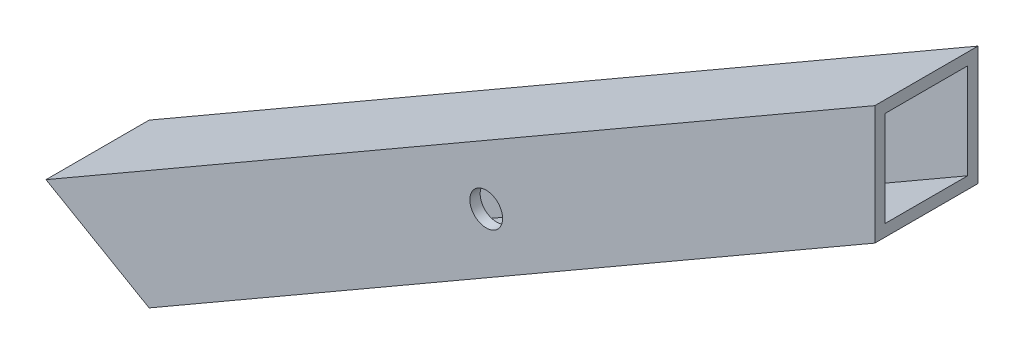
ISO-10303-21;
HEADER;
FILE_DESCRIPTION(('STEP AP214'),'2;1');
FILE_NAME('part.step','',(''),(''),'','','');
FILE_SCHEMA(('AUTOMOTIVE_DESIGN { 1 0 10303 214 1 1 1 1 }'));
ENDSEC;
DATA;
#1=APPLICATION_CONTEXT('core data for automotive mechanical design processes');
#2=APPLICATION_PROTOCOL_DEFINITION('international standard','automotive_design',2000,#1);
#3=PRODUCT_CONTEXT('',#1,'mechanical');
#4=PRODUCT('Part','Part','',(#3));
#5=PRODUCT_RELATED_PRODUCT_CATEGORY('part','',(#4));
#6=PRODUCT_DEFINITION_FORMATION('','',#4);
#7=PRODUCT_DEFINITION_CONTEXT('part definition',#1,'design');
#8=PRODUCT_DEFINITION('design','',#6,#7);
#9=PRODUCT_DEFINITION_SHAPE('','',#8);
#10=(LENGTH_UNIT() NAMED_UNIT(*) SI_UNIT(.MILLI.,.METRE.));
#11=(NAMED_UNIT(*) PLANE_ANGLE_UNIT() SI_UNIT($,.RADIAN.));
#12=(NAMED_UNIT(*) SI_UNIT($,.STERADIAN.) SOLID_ANGLE_UNIT());
#13=UNCERTAINTY_MEASURE_WITH_UNIT(LENGTH_MEASURE(1.E-05),#10,'distance_accuracy_value','');
#14=(GEOMETRIC_REPRESENTATION_CONTEXT(3) GLOBAL_UNCERTAINTY_ASSIGNED_CONTEXT((#13)) GLOBAL_UNIT_ASSIGNED_CONTEXT((#10,
#11,#12)) REPRESENTATION_CONTEXT('',''));
#15=CARTESIAN_POINT('',(0.,0.,0.));
#16=DIRECTION('',(0.,0.,1.));
#17=DIRECTION('',(1.,0.,0.));
#18=AXIS2_PLACEMENT_3D('',#15,#16,#17);
#19=CARTESIAN_POINT('',(-119.645362485505,207.231846715386,26.9147395775252));
#20=DIRECTION('',(0.,0.,1.));
#21=DIRECTION('',(1.,0.,0.));
#22=AXIS2_PLACEMENT_3D('',#19,#20,#21);
#23=CYLINDRICAL_SURFACE('',#22,5.0419);
#24=CARTESIAN_POINT('',(-119.645362485505,207.231846715386,28.575));
#25=DIRECTION('',(0.,0.,1.));
#26=DIRECTION('',(1.,0.,0.));
#27=AXIS2_PLACEMENT_3D('',#24,#25,#26);
#28=CIRCLE('',#27,5.0419);
#29=CARTESIAN_POINT('',(-114.603462485505,207.231846715386,28.575));
#30=VERTEX_POINT('',#29);
#31=EDGE_CURVE('E119',#30,#30,#28,.T.);
#32=ORIENTED_EDGE('',*,*,#31,.F.);
#33=EDGE_LOOP('',(#32));
#34=FACE_BOUND('',#33,.T.);
#35=CARTESIAN_POINT('',(-119.645362485505,207.231846715386,31.75));
#36=DIRECTION('',(0.,0.,1.));
#37=DIRECTION('',(1.,0.,0.));
#38=AXIS2_PLACEMENT_3D('',#35,#36,#37);
#39=CIRCLE('',#38,5.0419);
#40=CARTESIAN_POINT('',(-114.603462485505,207.231846715386,31.75));
#41=VERTEX_POINT('',#40);
#42=EDGE_CURVE('E112',#41,#41,#39,.T.);
#43=ORIENTED_EDGE('',*,*,#42,.T.);
#44=EDGE_LOOP('',(#43));
#45=FACE_BOUND('',#44,.T.);
#46=ADVANCED_FACE('F17',(#34,#45),#23,.F.);
#47=CARTESIAN_POINT('',(-119.645362485505,207.231846715386,26.9147395775252));
#48=DIRECTION('',(0.,0.,1.));
#49=DIRECTION('',(1.,0.,0.));
#50=AXIS2_PLACEMENT_3D('',#47,#48,#49);
#51=CYLINDRICAL_SURFACE('',#50,5.0419);
#52=CARTESIAN_POINT('',(-119.645362485505,207.231846715386,0.));
#53=DIRECTION('',(0.,0.,1.));
#54=DIRECTION('',(1.,0.,0.));
#55=AXIS2_PLACEMENT_3D('',#52,#53,#54);
#56=CIRCLE('',#55,5.0419);
#57=CARTESIAN_POINT('',(-114.603462485505,207.231846715386,0.));
#58=VERTEX_POINT('',#57);
#59=EDGE_CURVE('E121',#58,#58,#56,.T.);
#60=ORIENTED_EDGE('',*,*,#59,.F.);
#61=EDGE_LOOP('',(#60));
#62=FACE_BOUND('',#61,.T.);
#63=CARTESIAN_POINT('',(-119.645362485505,207.231846715386,3.175));
#64=DIRECTION('',(0.,0.,1.));
#65=DIRECTION('',(1.,0.,0.));
#66=AXIS2_PLACEMENT_3D('',#63,#64,#65);
#67=CIRCLE('',#66,5.0419);
#68=CARTESIAN_POINT('',(-114.603462485505,207.231846715386,3.175));
#69=VERTEX_POINT('',#68);
#70=EDGE_CURVE('E20',#69,#69,#67,.T.);
#71=ORIENTED_EDGE('',*,*,#70,.T.);
#72=EDGE_LOOP('',(#71));
#73=FACE_BOUND('',#72,.T.);
#74=ADVANCED_FACE('F135',(#62,#73),#51,.F.);
#75=CARTESIAN_POINT('',(432900.994029656,250193.483693439,20.4770471900706));
#76=DIRECTION('',(0.500000000000017,-0.866025403784429,0.));
#77=DIRECTION('',(0.866025403784429,0.500000000000017,0.));
#78=AXIS2_PLACEMENT_3D('',#75,#76,#77);
#79=PLANE('',#78);
#80=DIRECTION('',(0.,0.,1.));
#81=VECTOR('',#80,1.);
#82=CARTESIAN_POINT('',(-223.415724979338,128.989128958015,0.));
#83=LINE('',#82,#81);
#84=CARTESIAN_POINT('',(-223.415724980215,128.989128967668,31.75));
#85=VERTEX_POINT('',#84);
#86=CARTESIAN_POINT('',(-223.415724983477,128.989128973225,0.));
#87=VERTEX_POINT('',#86);
#88=EDGE_CURVE('E103',#85,#87,#83,.F.);
#89=ORIENTED_EDGE('',*,*,#88,.T.);
#90=DIRECTION('',(-0.866025403784422,-0.500000000000028,0.));
#91=VECTOR('',#90,1.);
#92=CARTESIAN_POINT('',(-6.42330633127131E-09,257.978257915966,0.));
#93=LINE('',#92,#91);
#94=CARTESIAN_POINT('',(-1.06474237053846E-08,257.97825792746,0.));
#95=VERTEX_POINT('',#94);
#96=EDGE_CURVE('E168',#95,#87,#93,.T.);
#97=ORIENTED_EDGE('',*,*,#96,.F.);
#98=DIRECTION('',(0.,0.,-1.));
#99=VECTOR('',#98,1.);
#100=CARTESIAN_POINT('',(0.,257.97825791596,0.));
#101=LINE('',#100,#99);
#102=CARTESIAN_POINT('',(-6.72807165445085E-09,257.978257922294,31.75));
#103=VERTEX_POINT('',#102);
#104=EDGE_CURVE('E164',#103,#95,#101,.T.);
#105=ORIENTED_EDGE('',*,*,#104,.F.);
#106=DIRECTION('',(-0.866025403784415,-0.500000000000041,0.));
#107=VECTOR('',#106,1.);
#108=CARTESIAN_POINT('',(-6.42330633127131E-09,257.978257915966,31.75));
#109=LINE('',#108,#107);
#110=EDGE_CURVE('E113',#103,#85,#109,.T.);
#111=ORIENTED_EDGE('',*,*,#110,.T.);
#112=EDGE_LOOP('',(#89,#97,#105,#111));
#113=FACE_BOUND('',#112,.T.);
#114=ADVANCED_FACE('F255',(#113),#79,.T.);
#115=CARTESIAN_POINT('',(432894.027468786,250205.55013113,3.175));
#116=DIRECTION('',(0.,0.,-1.));
#117=DIRECTION('',(-1.,0.,0.));
#118=AXIS2_PLACEMENT_3D('',#115,#116,#117);
#119=PLANE('',#118);
#120=ORIENTED_EDGE('',*,*,#70,.F.);
#121=EDGE_LOOP('',(#120));
#122=FACE_BOUND('',#121,.T.);
#123=DIRECTION('',(0.866025403784429,0.500000000000017,0.));
#124=VECTOR('',#123,1.);
#125=CARTESIAN_POINT('',(432886.706529656,250218.230369346,3.175));
#126=LINE('',#125,#124);
#127=CARTESIAN_POINT('',(-251.990724978744,145.48691290746,3.175));
#128=VERTEX_POINT('',#127);
#129=CARTESIAN_POINT('',(-6.89862056368895E-09,290.973825803202,3.175));
#130=VERTEX_POINT('',#129);
#131=EDGE_CURVE('E101',#128,#130,#126,.T.);
#132=ORIENTED_EDGE('',*,*,#131,.F.);
#133=DIRECTION('',(-0.866025403784429,0.500000000000017,0.));
#134=VECTOR('',#133,1.);
#135=CARTESIAN_POINT('',(-127.58286248553,73.66,3.175));
#136=LINE('',#135,#134);
#137=CARTESIAN_POINT('',(-226.59072497747,130.822216068166,3.175));
#138=VERTEX_POINT('',#137);
#139=EDGE_CURVE('E95',#128,#138,#136,.F.);
#140=ORIENTED_EDGE('',*,*,#139,.T.);
#141=DIRECTION('',(0.866025403784429,0.500000000000017,0.));
#142=VECTOR('',#141,1.);
#143=CARTESIAN_POINT('',(432899.406529656,250196.233324084,3.175));
#144=LINE('',#143,#142);
#145=CARTESIAN_POINT('',(-6.28846105142502E-09,261.644432126143,3.175));
#146=VERTEX_POINT('',#145);
#147=EDGE_CURVE('E79',#138,#146,#144,.T.);
#148=ORIENTED_EDGE('',*,*,#147,.T.);
#149=DIRECTION('',(0.,1.,0.));
#150=VECTOR('',#149,1.);
#151=CARTESIAN_POINT('',(0.,147.32,3.175));
#152=LINE('',#151,#150);
#153=EDGE_CURVE('E161',#130,#146,#152,.F.);
#154=ORIENTED_EDGE('',*,*,#153,.F.);
#155=EDGE_LOOP('',(#132,#140,#148,#154));
#156=FACE_BOUND('',#155,.T.);
#157=ADVANCED_FACE('F100',(#122,#156),#119,.F.);
#158=CARTESIAN_POINT('',(432899.406529656,250196.233324084,20.4770471900706));
#159=DIRECTION('',(0.500000000000017,-0.866025403784429,0.));
#160=DIRECTION('',(0.866025403784429,0.500000000000017,0.));
#161=AXIS2_PLACEMENT_3D('',#158,#159,#160);
#162=PLANE('',#161);
#163=ORIENTED_EDGE('',*,*,#147,.F.);
#164=DIRECTION('',(0.,0.,1.));
#165=VECTOR('',#164,1.);
#166=CARTESIAN_POINT('',(-226.590724976772,130.822216061211,0.));
#167=LINE('',#166,#165);
#168=CARTESIAN_POINT('',(-226.59072497985,130.822216072234,28.575));
#169=VERTEX_POINT('',#168);
#170=EDGE_CURVE('E83',#138,#169,#167,.T.);
#171=ORIENTED_EDGE('',*,*,#170,.T.);
#172=DIRECTION('',(-0.866025403784438,-0.500000000000001,0.));
#173=VECTOR('',#172,1.);
#174=CARTESIAN_POINT('',(-4.66116034658626E-09,261.644432122324,28.575));
#175=LINE('',#174,#173);
#176=CARTESIAN_POINT('',(-8.43460116017738E-09,261.644432130344,28.575));
#177=VERTEX_POINT('',#176);
#178=EDGE_CURVE('E88',#177,#169,#175,.T.);
#179=ORIENTED_EDGE('',*,*,#178,.F.);
#180=DIRECTION('',(0.,0.,-1.));
#181=VECTOR('',#180,1.);
#182=CARTESIAN_POINT('',(0.,261.644432122332,0.));
#183=LINE('',#182,#181);
#184=EDGE_CURVE('E84',#146,#177,#183,.F.);
#185=ORIENTED_EDGE('',*,*,#184,.F.);
#186=EDGE_LOOP('',(#163,#171,#179,#185));
#187=FACE_BOUND('',#186,.T.);
#188=ADVANCED_FACE('F81',(#187),#162,.F.);
#189=CARTESIAN_POINT('',(432891.994499522,250209.071337016,28.575));
#190=DIRECTION('',(0.,0.,-1.));
#191=DIRECTION('',(-1.,0.,0.));
#192=AXIS2_PLACEMENT_3D('',#189,#190,#191);
#193=PLANE('',#192);
#194=ORIENTED_EDGE('',*,*,#31,.T.);
#195=EDGE_LOOP('',(#194));
#196=FACE_BOUND('',#195,.T.);
#197=DIRECTION('',(-0.866025403784429,0.500000000000017,0.));
#198=VECTOR('',#197,1.);
#199=CARTESIAN_POINT('',(-127.58286248553,73.66,28.575));
#200=LINE('',#199,#198);
#201=CARTESIAN_POINT('',(-251.990724978744,145.48691290746,28.575));
#202=VERTEX_POINT('',#201);
#203=EDGE_CURVE('E98',#169,#202,#200,.T.);
#204=ORIENTED_EDGE('',*,*,#203,.T.);
#205=DIRECTION('',(0.866025403784429,0.500000000000017,0.));
#206=VECTOR('',#205,1.);
#207=CARTESIAN_POINT('',(432886.706529656,250218.230369346,28.575));
#208=LINE('',#207,#206);
#209=CARTESIAN_POINT('',(-6.89012735755057E-09,290.973825803228,28.575));
#210=VERTEX_POINT('',#209);
#211=EDGE_CURVE('E117',#210,#202,#208,.F.);
#212=ORIENTED_EDGE('',*,*,#211,.F.);
#213=DIRECTION('',(0.,1.,0.));
#214=VECTOR('',#213,1.);
#215=CARTESIAN_POINT('',(0.,147.32,28.575));
#216=LINE('',#215,#214);
#217=EDGE_CURVE('E155',#177,#210,#216,.T.);
#218=ORIENTED_EDGE('',*,*,#217,.F.);
#219=ORIENTED_EDGE('',*,*,#178,.T.);
#220=EDGE_LOOP('',(#204,#212,#218,#219));
#221=FACE_BOUND('',#220,.T.);
#222=ADVANCED_FACE('F130',(#196,#221),#193,.T.);
#223=CARTESIAN_POINT('',(432886.706529656,250218.230369346,20.4770471900706));
#224=DIRECTION('',(0.500000000000017,-0.866025403784429,0.));
#225=DIRECTION('',(0.866025403784429,0.500000000000017,0.));
#226=AXIS2_PLACEMENT_3D('',#223,#224,#225);
#227=PLANE('',#226);
#228=DIRECTION('',(0.,0.,1.));
#229=VECTOR('',#228,1.);
#230=CARTESIAN_POINT('',(-251.99072497795,145.486912899308,0.));
#231=LINE('',#230,#229);
#232=EDGE_CURVE('E170',#202,#128,#231,.F.);
#233=ORIENTED_EDGE('',*,*,#232,.T.);
#234=ORIENTED_EDGE('',*,*,#131,.T.);
#235=DIRECTION('',(0.,0.,-1.));
#236=VECTOR('',#235,1.);
#237=CARTESIAN_POINT('',(0.,290.973825798454,0.));
#238=LINE('',#237,#236);
#239=EDGE_CURVE('E150',#210,#130,#238,.T.);
#240=ORIENTED_EDGE('',*,*,#239,.F.);
#241=ORIENTED_EDGE('',*,*,#211,.T.);
#242=EDGE_LOOP('',(#233,#234,#240,#241));
#243=FACE_BOUND('',#242,.T.);
#244=ADVANCED_FACE('F141',(#243),#227,.T.);
#245=CARTESIAN_POINT('',(432891.994499522,250209.071337016,31.75));
#246=DIRECTION('',(0.,0.,-1.));
#247=DIRECTION('',(-1.,0.,0.));
#248=AXIS2_PLACEMENT_3D('',#245,#246,#247);
#249=PLANE('',#248);
#250=ORIENTED_EDGE('',*,*,#42,.F.);
#251=EDGE_LOOP('',(#250));
#252=FACE_BOUND('',#251,.T.);
#253=DIRECTION('',(0.866025403784429,0.500000000000017,0.));
#254=VECTOR('',#253,1.);
#255=CARTESIAN_POINT('',(432885.119029656,250220.979999991,31.75));
#256=LINE('',#255,#254);
#257=CARTESIAN_POINT('',(-4.71109262711877E-09,294.640000008064,31.75));
#258=VERTEX_POINT('',#257);
#259=CARTESIAN_POINT('',(-255.16572497594,147.320000007998,31.75));
#260=VERTEX_POINT('',#259);
#261=EDGE_CURVE('E145',#258,#260,#256,.F.);
#262=ORIENTED_EDGE('',*,*,#261,.T.);
#263=DIRECTION('',(-0.866025403784429,0.500000000000017,0.));
#264=VECTOR('',#263,1.);
#265=CARTESIAN_POINT('',(-127.58286248553,73.66,31.75));
#266=LINE('',#265,#264);
#267=EDGE_CURVE('E106',#260,#85,#266,.F.);
#268=ORIENTED_EDGE('',*,*,#267,.T.);
#269=ORIENTED_EDGE('',*,*,#110,.F.);
#270=DIRECTION('',(0.,1.,0.));
#271=VECTOR('',#270,1.);
#272=CARTESIAN_POINT('',(0.,147.32,31.75));
#273=LINE('',#272,#271);
#274=EDGE_CURVE('E124',#258,#103,#273,.F.);
#275=ORIENTED_EDGE('',*,*,#274,.F.);
#276=EDGE_LOOP('',(#262,#268,#269,#275));
#277=FACE_BOUND('',#276,.T.);
#278=ADVANCED_FACE('F138',(#252,#277),#249,.F.);
#279=CARTESIAN_POINT('',(-127.58286248553,73.66,0.));
#280=DIRECTION('',(0.500000000000017,0.866025403784429,0.));
#281=DIRECTION('',(-0.866025403784429,0.500000000000017,0.));
#282=AXIS2_PLACEMENT_3D('',#279,#280,#281);
#283=PLANE('',#282);
#284=ORIENTED_EDGE('',*,*,#203,.F.);
#285=ORIENTED_EDGE('',*,*,#170,.F.);
#286=ORIENTED_EDGE('',*,*,#139,.F.);
#287=ORIENTED_EDGE('',*,*,#232,.F.);
#288=EDGE_LOOP('',(#284,#285,#286,#287));
#289=FACE_BOUND('',#288,.T.);
#290=ORIENTED_EDGE('',*,*,#88,.F.);
#291=ORIENTED_EDGE('',*,*,#267,.F.);
#292=DIRECTION('',(0.,0.,1.));
#293=VECTOR('',#292,1.);
#294=CARTESIAN_POINT('',(-255.165724981168,147.320000018482,20.4770471900706));
#295=LINE('',#294,#293);
#296=CARTESIAN_POINT('',(-255.165724976376,147.320000007239,0.));
#297=VERTEX_POINT('',#296);
#298=EDGE_CURVE('E149',#260,#297,#295,.F.);
#299=ORIENTED_EDGE('',*,*,#298,.T.);
#300=DIRECTION('',(-0.866025403821908,0.499999999935102,0.));
#301=VECTOR('',#300,1.);
#302=CARTESIAN_POINT('',(-223.415724976235,128.98912896344,0.));
#303=LINE('',#302,#301);
#304=EDGE_CURVE('E125',#87,#297,#303,.T.);
#305=ORIENTED_EDGE('',*,*,#304,.F.);
#306=EDGE_LOOP('',(#290,#291,#299,#305));
#307=FACE_BOUND('',#306,.T.);
#308=ADVANCED_FACE('F92',(#289,#307),#283,.F.);
#309=CARTESIAN_POINT('',(432894.027468786,250205.55013113,0.));
#310=DIRECTION('',(0.,0.,-1.));
#311=DIRECTION('',(-1.,0.,0.));
#312=AXIS2_PLACEMENT_3D('',#309,#310,#311);
#313=PLANE('',#312);
#314=ORIENTED_EDGE('',*,*,#59,.T.);
#315=EDGE_LOOP('',(#314));
#316=FACE_BOUND('',#315,.T.);
#317=ORIENTED_EDGE('',*,*,#304,.T.);
#318=DIRECTION('',(0.866025403784429,0.500000000000017,0.));
#319=VECTOR('',#318,1.);
#320=CARTESIAN_POINT('',(432885.119029656,250220.979999991,0.));
#321=LINE('',#320,#319);
#322=CARTESIAN_POINT('',(-4.70781746919613E-09,294.640000008073,0.));
#323=VERTEX_POINT('',#322);
#324=EDGE_CURVE('E26',#297,#323,#321,.T.);
#325=ORIENTED_EDGE('',*,*,#324,.T.);
#326=DIRECTION('',(0.,1.,0.));
#327=VECTOR('',#326,1.);
#328=CARTESIAN_POINT('',(0.,147.32,0.));
#329=LINE('',#328,#327);
#330=EDGE_CURVE('E34',#95,#323,#329,.T.);
#331=ORIENTED_EDGE('',*,*,#330,.F.);
#332=ORIENTED_EDGE('',*,*,#96,.T.);
#333=EDGE_LOOP('',(#317,#325,#331,#332));
#334=FACE_BOUND('',#333,.T.);
#335=ADVANCED_FACE('F190',(#316,#334),#313,.T.);
#336=CARTESIAN_POINT('',(0.,147.32,0.));
#337=DIRECTION('',(1.,0.,0.));
#338=DIRECTION('',(0.,0.,-1.));
#339=AXIS2_PLACEMENT_3D('',#336,#337,#338);
#340=PLANE('',#339);
#341=ORIENTED_EDGE('',*,*,#217,.T.);
#342=ORIENTED_EDGE('',*,*,#239,.T.);
#343=ORIENTED_EDGE('',*,*,#153,.T.);
#344=ORIENTED_EDGE('',*,*,#184,.T.);
#345=EDGE_LOOP('',(#341,#342,#343,#344));
#346=FACE_BOUND('',#345,.T.);
#347=ORIENTED_EDGE('',*,*,#104,.T.);
#348=ORIENTED_EDGE('',*,*,#330,.T.);
#349=DIRECTION('',(0.,0.,1.));
#350=VECTOR('',#349,1.);
#351=CARTESIAN_POINT('',(-1.13118403533008E-08,294.640000017807,20.4770471900706));
#352=LINE('',#351,#350);
#353=EDGE_CURVE('E11',#323,#258,#352,.T.);
#354=ORIENTED_EDGE('',*,*,#353,.T.);
#355=ORIENTED_EDGE('',*,*,#274,.T.);
#356=EDGE_LOOP('',(#347,#348,#354,#355));
#357=FACE_BOUND('',#356,.T.);
#358=ADVANCED_FACE('F175',(#346,#357),#340,.T.);
#359=CARTESIAN_POINT('',(432885.119029656,250220.979999991,20.4770471900706));
#360=DIRECTION('',(0.500000000000017,-0.866025403784429,0.));
#361=DIRECTION('',(0.866025403784429,0.500000000000017,0.));
#362=AXIS2_PLACEMENT_3D('',#359,#360,#361);
#363=PLANE('',#362);
#364=ORIENTED_EDGE('',*,*,#324,.F.);
#365=ORIENTED_EDGE('',*,*,#298,.F.);
#366=ORIENTED_EDGE('',*,*,#261,.F.);
#367=ORIENTED_EDGE('',*,*,#353,.F.);
#368=EDGE_LOOP('',(#364,#365,#366,#367));
#369=FACE_BOUND('',#368,.T.);
#370=ADVANCED_FACE('F184',(#369),#363,.F.);
#371=CLOSED_SHELL('',(#46,#74,#114,#157,#188,#222,#244,#278,#308,#335,#358,#370));
#372=MANIFOLD_SOLID_BREP('B1',#371);
#373=ADVANCED_BREP_SHAPE_REPRESENTATION('',(#18,#372),#14);
#374=SHAPE_DEFINITION_REPRESENTATION(#9,#373);
ENDSEC;
END-ISO-10303-21;
